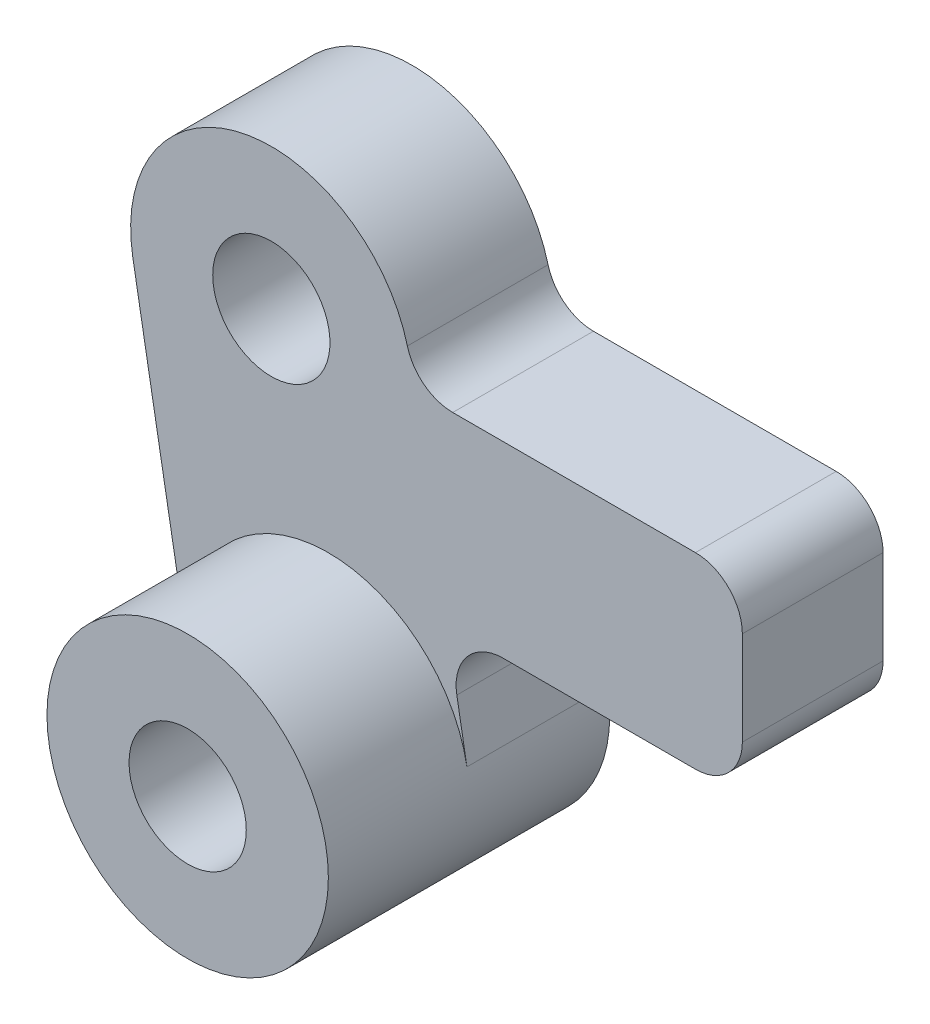
ISO-10303-21;
HEADER;
FILE_DESCRIPTION(('STEP AP214'),'2;1');
FILE_NAME('part.step','',(''),(''),'','','');
FILE_SCHEMA(('AUTOMOTIVE_DESIGN { 1 0 10303 214 1 1 1 1 }'));
ENDSEC;
DATA;
#1=APPLICATION_CONTEXT('core data for automotive mechanical design processes');
#2=APPLICATION_PROTOCOL_DEFINITION('international standard','automotive_design',2000,#1);
#3=PRODUCT_CONTEXT('',#1,'mechanical');
#4=PRODUCT('Part','Part','',(#3));
#5=PRODUCT_RELATED_PRODUCT_CATEGORY('part','',(#4));
#6=PRODUCT_DEFINITION_FORMATION('','',#4);
#7=PRODUCT_DEFINITION_CONTEXT('part definition',#1,'design');
#8=PRODUCT_DEFINITION('design','',#6,#7);
#9=PRODUCT_DEFINITION_SHAPE('','',#8);
#10=(LENGTH_UNIT() NAMED_UNIT(*) SI_UNIT(.MILLI.,.METRE.));
#11=(NAMED_UNIT(*) PLANE_ANGLE_UNIT() SI_UNIT($,.RADIAN.));
#12=(NAMED_UNIT(*) SI_UNIT($,.STERADIAN.) SOLID_ANGLE_UNIT());
#13=UNCERTAINTY_MEASURE_WITH_UNIT(LENGTH_MEASURE(1.E-05),#10,'distance_accuracy_value','');
#14=(GEOMETRIC_REPRESENTATION_CONTEXT(3) GLOBAL_UNCERTAINTY_ASSIGNED_CONTEXT((#13)) GLOBAL_UNIT_ASSIGNED_CONTEXT((#10,
#11,#12)) REPRESENTATION_CONTEXT('',''));
#15=CARTESIAN_POINT('',(0.,0.,0.));
#16=DIRECTION('',(0.,0.,1.));
#17=DIRECTION('',(1.,0.,0.));
#18=AXIS2_PLACEMENT_3D('',#15,#16,#17);
#19=CARTESIAN_POINT('',(0.,0.,7.));
#20=DIRECTION('',(0.,0.,-1.));
#21=DIRECTION('',(-1.,0.,0.));
#22=AXIS2_PLACEMENT_3D('',#19,#20,#21);
#23=PLANE('',#22);
#24=CARTESIAN_POINT('',(15.130794685724,7.42219403539736,7.));
#25=DIRECTION('',(0.,0.,-1.));
#26=DIRECTION('',(-1.,0.,0.));
#27=AXIS2_PLACEMENT_3D('',#24,#25,#26);
#28=CIRCLE('',#27,1.25);
#29=CARTESIAN_POINT('',(13.880794685724,7.42219403539736,7.));
#30=VERTEX_POINT('',#29);
#31=EDGE_CURVE('E168',#30,#30,#28,.T.);
#32=ORIENTED_EDGE('',*,*,#31,.T.);
#33=EDGE_LOOP('',(#32));
#34=FACE_BOUND('',#33,.T.);
#35=DIRECTION('',(-1.,0.,0.));
#36=VECTOR('',#35,1.);
#37=CARTESIAN_POINT('',(0.,3.44313856839816,7.));
#38=LINE('',#37,#36);
#39=CARTESIAN_POINT('',(24.1733814351149,3.44313856839815,7.));
#40=VERTEX_POINT('',#39);
#41=CARTESIAN_POINT('',(20.070442950543,3.44313856839815,7.));
#42=VERTEX_POINT('',#41);
#43=EDGE_CURVE('E219',#40,#42,#38,.T.);
#44=ORIENTED_EDGE('',*,*,#43,.F.);
#45=CARTESIAN_POINT('',(24.1733814351149,4.44313856839815,7.));
#46=DIRECTION('',(0.,0.,-1.));
#47=DIRECTION('',(-1.,0.,0.));
#48=AXIS2_PLACEMENT_3D('',#45,#46,#47);
#49=CIRCLE('',#48,1.);
#50=CARTESIAN_POINT('',(25.1733814351149,4.44313856839815,7.));
#51=VERTEX_POINT('',#50);
#52=EDGE_CURVE('E50',#40,#51,#49,.F.);
#53=ORIENTED_EDGE('',*,*,#52,.T.);
#54=DIRECTION('',(0.,1.,0.));
#55=VECTOR('',#54,1.);
#56=CARTESIAN_POINT('',(25.1733814351149,0.,7.));
#57=LINE('',#56,#55);
#58=CARTESIAN_POINT('',(25.1733814351149,6.44313856839815,7.));
#59=VERTEX_POINT('',#58);
#60=EDGE_CURVE('E218',#51,#59,#57,.T.);
#61=ORIENTED_EDGE('',*,*,#60,.T.);
#62=CARTESIAN_POINT('',(24.1733814351149,6.44313856839815,7.));
#63=DIRECTION('',(0.,0.,-1.));
#64=DIRECTION('',(-1.,0.,0.));
#65=AXIS2_PLACEMENT_3D('',#62,#63,#64);
#66=CIRCLE('',#65,1.);
#67=CARTESIAN_POINT('',(24.1733814351149,7.44313856839815,7.));
#68=VERTEX_POINT('',#67);
#69=EDGE_CURVE('E57',#59,#68,#66,.F.);
#70=ORIENTED_EDGE('',*,*,#69,.T.);
#71=DIRECTION('',(-1.,0.,0.));
#72=VECTOR('',#71,1.);
#73=CARTESIAN_POINT('',(0.,7.44313856839816,7.));
#74=LINE('',#73,#72);
#75=CARTESIAN_POINT('',(18.998309683825,7.44313856839815,7.));
#76=VERTEX_POINT('',#75);
#77=EDGE_CURVE('E228',#68,#76,#74,.T.);
#78=ORIENTED_EDGE('',*,*,#77,.T.);
#79=CARTESIAN_POINT('',(18.998309683825,8.44313856839815,7.));
#80=DIRECTION('',(0.,0.,-1.));
#81=DIRECTION('',(-1.,0.,0.));
#82=AXIS2_PLACEMENT_3D('',#79,#80,#81);
#83=CIRCLE('',#82,1.);
#84=CARTESIAN_POINT('',(18.0314309342997,8.18790243514795,7.));
#85=VERTEX_POINT('',#84);
#86=EDGE_CURVE('E194',#76,#85,#83,.T.);
#87=ORIENTED_EDGE('',*,*,#86,.T.);
#88=CARTESIAN_POINT('',(15.130794685724,7.42219403539736,7.));
#89=DIRECTION('',(0.,0.,-1.));
#90=DIRECTION('',(-1.,0.,0.));
#91=AXIS2_PLACEMENT_3D('',#88,#89,#90);
#92=CIRCLE('',#91,2.99999999999998);
#93=CARTESIAN_POINT('',(12.1763714266874,6.90124950239657,7.));
#94=VERTEX_POINT('',#93);
#95=EDGE_CURVE('E139',#94,#85,#92,.T.);
#96=ORIENTED_EDGE('',*,*,#95,.F.);
#97=DIRECTION('',(0.17364817766693,-0.984807753012208,0.));
#98=VECTOR('',#97,1.);
#99=CARTESIAN_POINT('',(12.9893920741149,2.29038028566714,7.));
#100=LINE('',#99,#98);
#101=CARTESIAN_POINT('',(13.3919086703559,0.0075952313111175,7.));
#102=VERTEX_POINT('',#101);
#103=EDGE_CURVE('E145',#94,#102,#100,.T.);
#104=ORIENTED_EDGE('',*,*,#103,.T.);
#105=CARTESIAN_POINT('',(16.3463319293926,0.528539764311909,7.));
#106=DIRECTION('',(0.,0.,1.));
#107=DIRECTION('',(1.,0.,0.));
#108=AXIS2_PLACEMENT_3D('',#105,#106,#107);
#109=CIRCLE('',#108,3.);
#110=CARTESIAN_POINT('',(19.3007551884292,1.0494842973127,7.));
#111=VERTEX_POINT('',#110);
#112=EDGE_CURVE('E142',#111,#102,#109,.T.);
#113=ORIENTED_EDGE('',*,*,#112,.F.);
#114=DIRECTION('',(0.173648177666929,-0.984807753012208,0.));
#115=VECTOR('',#114,1.);
#116=CARTESIAN_POINT('',(18.8982385921882,3.33226935166871,7.));
#117=LINE('',#116,#115);
#118=CARTESIAN_POINT('',(19.0856351975308,2.26949039073122,7.));
#119=VERTEX_POINT('',#118);
#120=EDGE_CURVE('E127',#119,#111,#117,.T.);
#121=ORIENTED_EDGE('',*,*,#120,.F.);
#122=CARTESIAN_POINT('',(20.070442950543,2.44313856839815,7.));
#123=DIRECTION('',(0.,0.,-1.));
#124=DIRECTION('',(-1.,0.,0.));
#125=AXIS2_PLACEMENT_3D('',#122,#123,#124);
#126=CIRCLE('',#125,1.);
#127=EDGE_CURVE('E188',#119,#42,#126,.T.);
#128=ORIENTED_EDGE('',*,*,#127,.T.);
#129=EDGE_LOOP('',(#44,#53,#61,#70,#78,#87,#96,#104,#113,#121,#128));
#130=FACE_BOUND('',#129,.T.);
#131=ADVANCED_FACE('F41',(#34,#130),#23,.F.);
#132=CARTESIAN_POINT('',(18.8982385921882,3.33226935166871,4.));
#133=DIRECTION('',(-0.984807753012208,-0.173648177666929,0.));
#134=DIRECTION('',(0.173648177666929,-0.984807753012208,0.));
#135=AXIS2_PLACEMENT_3D('',#132,#133,#134);
#136=PLANE('',#135);
#137=DIRECTION('',(0.173648177666929,-0.984807753012208,0.));
#138=VECTOR('',#137,1.);
#139=CARTESIAN_POINT('',(18.8982385921882,3.33226935166871,4.));
#140=LINE('',#139,#138);
#141=CARTESIAN_POINT('',(19.0856351975308,2.26949039073122,4.));
#142=VERTEX_POINT('',#141);
#143=CARTESIAN_POINT('',(19.3007551884292,1.0494842973127,4.));
#144=VERTEX_POINT('',#143);
#145=EDGE_CURVE('E255',#142,#144,#140,.T.);
#146=ORIENTED_EDGE('',*,*,#145,.F.);
#147=DIRECTION('',(0.,0.,-1.));
#148=VECTOR('',#147,1.);
#149=CARTESIAN_POINT('',(19.0856351975308,2.26949039073122,7.));
#150=LINE('',#149,#148);
#151=EDGE_CURVE('E135',#142,#119,#150,.F.);
#152=ORIENTED_EDGE('',*,*,#151,.T.);
#153=ORIENTED_EDGE('',*,*,#120,.T.);
#154=DIRECTION('',(0.,0.,1.));
#155=VECTOR('',#154,1.);
#156=CARTESIAN_POINT('',(19.3007551884292,1.0494842973127,4.));
#157=LINE('',#156,#155);
#158=EDGE_CURVE('E132',#144,#111,#157,.T.);
#159=ORIENTED_EDGE('',*,*,#158,.F.);
#160=EDGE_LOOP('',(#146,#152,#153,#159));
#161=FACE_BOUND('',#160,.T.);
#162=ADVANCED_FACE('F130',(#161),#136,.F.);
#163=CARTESIAN_POINT('',(12.9893920741149,2.29038028566714,4.));
#164=DIRECTION('',(-0.984807753012208,-0.17364817766693,0.));
#165=DIRECTION('',(0.17364817766693,-0.984807753012208,0.));
#166=AXIS2_PLACEMENT_3D('',#163,#164,#165);
#167=PLANE('',#166);
#168=ORIENTED_EDGE('',*,*,#103,.F.);
#169=DIRECTION('',(0.,0.,1.));
#170=VECTOR('',#169,1.);
#171=CARTESIAN_POINT('',(12.1763714266874,6.90124950239657,4.));
#172=LINE('',#171,#170);
#173=CARTESIAN_POINT('',(12.1763714266874,6.90124950239657,4.));
#174=VERTEX_POINT('',#173);
#175=EDGE_CURVE('E157',#174,#94,#172,.T.);
#176=ORIENTED_EDGE('',*,*,#175,.F.);
#177=DIRECTION('',(0.17364817766693,-0.984807753012208,0.));
#178=VECTOR('',#177,1.);
#179=CARTESIAN_POINT('',(12.9893920741149,2.29038028566714,4.));
#180=LINE('',#179,#178);
#181=CARTESIAN_POINT('',(13.3919086703559,0.0075952313111175,4.));
#182=VERTEX_POINT('',#181);
#183=EDGE_CURVE('E138',#174,#182,#180,.T.);
#184=ORIENTED_EDGE('',*,*,#183,.T.);
#185=DIRECTION('',(0.,0.,1.));
#186=VECTOR('',#185,1.);
#187=CARTESIAN_POINT('',(13.3919086703559,0.0075952313111175,4.));
#188=LINE('',#187,#186);
#189=EDGE_CURVE('E158',#182,#102,#188,.T.);
#190=ORIENTED_EDGE('',*,*,#189,.T.);
#191=EDGE_LOOP('',(#168,#176,#184,#190));
#192=FACE_BOUND('',#191,.T.);
#193=ADVANCED_FACE('F304',(#192),#167,.T.);
#194=CARTESIAN_POINT('',(15.130794685724,7.42219403539736,4.));
#195=DIRECTION('',(0.,0.,1.));
#196=DIRECTION('',(1.,0.,0.));
#197=AXIS2_PLACEMENT_3D('',#194,#195,#196);
#198=CYLINDRICAL_SURFACE('',#197,2.99999999999998);
#199=ORIENTED_EDGE('',*,*,#95,.T.);
#200=DIRECTION('',(0.,0.,1.));
#201=VECTOR('',#200,1.);
#202=CARTESIAN_POINT('',(18.0314309342997,8.18790243514795,4.));
#203=LINE('',#202,#201);
#204=CARTESIAN_POINT('',(18.0314309342997,8.18790243514795,4.));
#205=VERTEX_POINT('',#204);
#206=EDGE_CURVE('E177',#85,#205,#203,.F.);
#207=ORIENTED_EDGE('',*,*,#206,.T.);
#208=CARTESIAN_POINT('',(15.130794685724,7.42219403539736,4.));
#209=DIRECTION('',(0.,0.,-1.));
#210=DIRECTION('',(-1.,0.,0.));
#211=AXIS2_PLACEMENT_3D('',#208,#209,#210);
#212=CIRCLE('',#211,2.99999999999998);
#213=EDGE_CURVE('E251',#174,#205,#212,.T.);
#214=ORIENTED_EDGE('',*,*,#213,.F.);
#215=ORIENTED_EDGE('',*,*,#175,.T.);
#216=EDGE_LOOP('',(#199,#207,#214,#215));
#217=FACE_BOUND('',#216,.T.);
#218=ADVANCED_FACE('F267',(#217),#198,.T.);
#219=CARTESIAN_POINT('',(16.3463319293926,0.528539764311909,4.));
#220=DIRECTION('',(0.,0.,1.));
#221=DIRECTION('',(1.,0.,0.));
#222=AXIS2_PLACEMENT_3D('',#219,#220,#221);
#223=CYLINDRICAL_SURFACE('',#222,3.);
#224=ORIENTED_EDGE('',*,*,#158,.T.);
#225=ORIENTED_EDGE('',*,*,#112,.T.);
#226=ORIENTED_EDGE('',*,*,#189,.F.);
#227=CARTESIAN_POINT('',(16.3463319293926,0.528539764311909,4.));
#228=DIRECTION('',(0.,0.,-1.));
#229=DIRECTION('',(-1.,0.,0.));
#230=AXIS2_PLACEMENT_3D('',#227,#228,#229);
#231=CIRCLE('',#230,3.);
#232=EDGE_CURVE('E155',#144,#182,#231,.T.);
#233=ORIENTED_EDGE('',*,*,#232,.F.);
#234=EDGE_LOOP('',(#224,#225,#226,#233));
#235=FACE_BOUND('',#234,.T.);
#236=CARTESIAN_POINT('',(16.3463319293926,0.528539764311909,10.));
#237=DIRECTION('',(0.,0.,1.));
#238=DIRECTION('',(1.,0.,0.));
#239=AXIS2_PLACEMENT_3D('',#236,#237,#238);
#240=CIRCLE('',#239,3.);
#241=CARTESIAN_POINT('',(19.3463319293926,0.528539764311909,10.));
#242=VERTEX_POINT('',#241);
#243=EDGE_CURVE('E150',#242,#242,#240,.T.);
#244=ORIENTED_EDGE('',*,*,#243,.F.);
#245=EDGE_LOOP('',(#244));
#246=FACE_BOUND('',#245,.T.);
#247=ADVANCED_FACE('F153',(#235,#246),#223,.T.);
#248=CARTESIAN_POINT('',(0.,0.,4.));
#249=DIRECTION('',(0.,0.,-1.));
#250=DIRECTION('',(-1.,0.,0.));
#251=AXIS2_PLACEMENT_3D('',#248,#249,#250);
#252=PLANE('',#251);
#253=CARTESIAN_POINT('',(16.3463319293926,0.528539764311909,4.));
#254=DIRECTION('',(0.,0.,-1.));
#255=DIRECTION('',(-1.,0.,0.));
#256=AXIS2_PLACEMENT_3D('',#253,#254,#255);
#257=CIRCLE('',#256,1.25);
#258=CARTESIAN_POINT('',(15.0963319293926,0.528539764311909,4.));
#259=VERTEX_POINT('',#258);
#260=EDGE_CURVE('E227',#259,#259,#257,.T.);
#261=ORIENTED_EDGE('',*,*,#260,.F.);
#262=EDGE_LOOP('',(#261));
#263=FACE_BOUND('',#262,.T.);
#264=CARTESIAN_POINT('',(15.130794685724,7.42219403539736,4.));
#265=DIRECTION('',(0.,0.,-1.));
#266=DIRECTION('',(-1.,0.,0.));
#267=AXIS2_PLACEMENT_3D('',#264,#265,#266);
#268=CIRCLE('',#267,1.25);
#269=CARTESIAN_POINT('',(13.880794685724,7.42219403539736,4.));
#270=VERTEX_POINT('',#269);
#271=EDGE_CURVE('E171',#270,#270,#268,.T.);
#272=ORIENTED_EDGE('',*,*,#271,.F.);
#273=EDGE_LOOP('',(#272));
#274=FACE_BOUND('',#273,.T.);
#275=DIRECTION('',(0.,-1.,0.));
#276=VECTOR('',#275,1.);
#277=CARTESIAN_POINT('',(25.1733814351149,0.,4.));
#278=LINE('',#277,#276);
#279=CARTESIAN_POINT('',(25.1733814351149,6.44313856839815,4.));
#280=VERTEX_POINT('',#279);
#281=CARTESIAN_POINT('',(25.1733814351149,4.44313856839815,4.));
#282=VERTEX_POINT('',#281);
#283=EDGE_CURVE('E235',#280,#282,#278,.T.);
#284=ORIENTED_EDGE('',*,*,#283,.T.);
#285=CARTESIAN_POINT('',(24.1733814351149,4.44313856839815,4.));
#286=DIRECTION('',(0.,0.,-1.));
#287=DIRECTION('',(-1.,0.,0.));
#288=AXIS2_PLACEMENT_3D('',#285,#286,#287);
#289=CIRCLE('',#288,1.);
#290=CARTESIAN_POINT('',(24.1733814351149,3.44313856839815,4.));
#291=VERTEX_POINT('',#290);
#292=EDGE_CURVE('E207',#282,#291,#289,.T.);
#293=ORIENTED_EDGE('',*,*,#292,.T.);
#294=DIRECTION('',(1.,0.,0.));
#295=VECTOR('',#294,1.);
#296=CARTESIAN_POINT('',(0.,3.44313856839816,4.));
#297=LINE('',#296,#295);
#298=CARTESIAN_POINT('',(20.070442950543,3.44313856839815,4.));
#299=VERTEX_POINT('',#298);
#300=EDGE_CURVE('E234',#299,#291,#297,.T.);
#301=ORIENTED_EDGE('',*,*,#300,.F.);
#302=CARTESIAN_POINT('',(20.070442950543,2.44313856839815,4.));
#303=DIRECTION('',(0.,0.,-1.));
#304=DIRECTION('',(-1.,0.,0.));
#305=AXIS2_PLACEMENT_3D('',#302,#303,#304);
#306=CIRCLE('',#305,1.);
#307=EDGE_CURVE('E185',#299,#142,#306,.F.);
#308=ORIENTED_EDGE('',*,*,#307,.T.);
#309=ORIENTED_EDGE('',*,*,#145,.T.);
#310=ORIENTED_EDGE('',*,*,#232,.T.);
#311=ORIENTED_EDGE('',*,*,#183,.F.);
#312=ORIENTED_EDGE('',*,*,#213,.T.);
#313=CARTESIAN_POINT('',(18.998309683825,8.44313856839815,4.));
#314=DIRECTION('',(0.,0.,-1.));
#315=DIRECTION('',(-1.,0.,0.));
#316=AXIS2_PLACEMENT_3D('',#313,#314,#315);
#317=CIRCLE('',#316,1.);
#318=CARTESIAN_POINT('',(18.998309683825,7.44313856839815,4.));
#319=VERTEX_POINT('',#318);
#320=EDGE_CURVE('E191',#205,#319,#317,.F.);
#321=ORIENTED_EDGE('',*,*,#320,.T.);
#322=DIRECTION('',(1.,0.,0.));
#323=VECTOR('',#322,1.);
#324=CARTESIAN_POINT('',(0.,7.44313856839816,4.));
#325=LINE('',#324,#323);
#326=CARTESIAN_POINT('',(24.1733814351149,7.44313856839815,4.));
#327=VERTEX_POINT('',#326);
#328=EDGE_CURVE('E241',#319,#327,#325,.T.);
#329=ORIENTED_EDGE('',*,*,#328,.T.);
#330=CARTESIAN_POINT('',(24.1733814351149,6.44313856839815,4.));
#331=DIRECTION('',(0.,0.,-1.));
#332=DIRECTION('',(-1.,0.,0.));
#333=AXIS2_PLACEMENT_3D('',#330,#331,#332);
#334=CIRCLE('',#333,1.);
#335=EDGE_CURVE('E204',#327,#280,#334,.T.);
#336=ORIENTED_EDGE('',*,*,#335,.T.);
#337=EDGE_LOOP('',(#284,#293,#301,#308,#309,#310,#311,#312,#321,#329,#336));
#338=FACE_BOUND('',#337,.T.);
#339=ADVANCED_FACE('F233',(#263,#274,#338),#252,.T.);
#340=CARTESIAN_POINT('',(15.130794685724,7.42219403539736,10.));
#341=DIRECTION('',(0.,0.,-1.));
#342=DIRECTION('',(-1.,0.,0.));
#343=AXIS2_PLACEMENT_3D('',#340,#341,#342);
#344=CYLINDRICAL_SURFACE('',#343,1.25);
#345=ORIENTED_EDGE('',*,*,#271,.T.);
#346=EDGE_LOOP('',(#345));
#347=FACE_BOUND('',#346,.T.);
#348=ORIENTED_EDGE('',*,*,#31,.F.);
#349=EDGE_LOOP('',(#348));
#350=FACE_BOUND('',#349,.T.);
#351=ADVANCED_FACE('F301',(#347,#350),#344,.F.);
#352=CARTESIAN_POINT('',(16.3463319293926,0.528539764311909,10.));
#353=DIRECTION('',(0.,0.,-1.));
#354=DIRECTION('',(-1.,0.,0.));
#355=AXIS2_PLACEMENT_3D('',#352,#353,#354);
#356=CYLINDRICAL_SURFACE('',#355,1.25);
#357=ORIENTED_EDGE('',*,*,#260,.T.);
#358=EDGE_LOOP('',(#357));
#359=FACE_BOUND('',#358,.T.);
#360=CARTESIAN_POINT('',(16.3463319293926,0.528539764311909,10.));
#361=DIRECTION('',(0.,0.,1.));
#362=DIRECTION('',(1.,0.,0.));
#363=AXIS2_PLACEMENT_3D('',#360,#361,#362);
#364=CIRCLE('',#363,1.25);
#365=CARTESIAN_POINT('',(17.5963319293926,0.528539764311909,10.));
#366=VERTEX_POINT('',#365);
#367=EDGE_CURVE('E151',#366,#366,#364,.T.);
#368=ORIENTED_EDGE('',*,*,#367,.T.);
#369=EDGE_LOOP('',(#368));
#370=FACE_BOUND('',#369,.T.);
#371=ADVANCED_FACE('F287',(#359,#370),#356,.F.);
#372=CARTESIAN_POINT('',(0.,7.44313856839816,15.0622577482985));
#373=DIRECTION('',(0.,1.,0.));
#374=DIRECTION('',(-1.,0.,0.));
#375=AXIS2_PLACEMENT_3D('',#372,#373,#374);
#376=PLANE('',#375);
#377=ORIENTED_EDGE('',*,*,#77,.F.);
#378=DIRECTION('',(0.,0.,-1.));
#379=VECTOR('',#378,1.);
#380=CARTESIAN_POINT('',(24.1733814351149,7.44313856839815,15.0622577482985));
#381=LINE('',#380,#379);
#382=EDGE_CURVE('E11',#68,#327,#381,.T.);
#383=ORIENTED_EDGE('',*,*,#382,.T.);
#384=ORIENTED_EDGE('',*,*,#328,.F.);
#385=DIRECTION('',(0.,0.,1.));
#386=VECTOR('',#385,1.);
#387=CARTESIAN_POINT('',(18.998309683825,7.44313856839815,15.0622577482985));
#388=LINE('',#387,#386);
#389=EDGE_CURVE('E181',#319,#76,#388,.T.);
#390=ORIENTED_EDGE('',*,*,#389,.T.);
#391=EDGE_LOOP('',(#377,#383,#384,#390));
#392=FACE_BOUND('',#391,.T.);
#393=ADVANCED_FACE('F277',(#392),#376,.T.);
#394=CARTESIAN_POINT('',(0.,3.44313856839816,15.0622577482985));
#395=DIRECTION('',(0.,1.,0.));
#396=DIRECTION('',(-1.,0.,0.));
#397=AXIS2_PLACEMENT_3D('',#394,#395,#396);
#398=PLANE('',#397);
#399=ORIENTED_EDGE('',*,*,#300,.T.);
#400=DIRECTION('',(0.,0.,-1.));
#401=VECTOR('',#400,1.);
#402=CARTESIAN_POINT('',(24.1733814351149,3.44313856839815,7.));
#403=LINE('',#402,#401);
#404=EDGE_CURVE('E65',#291,#40,#403,.F.);
#405=ORIENTED_EDGE('',*,*,#404,.T.);
#406=ORIENTED_EDGE('',*,*,#43,.T.);
#407=DIRECTION('',(0.,0.,-1.));
#408=VECTOR('',#407,1.);
#409=CARTESIAN_POINT('',(20.070442950543,3.44313856839815,4.));
#410=LINE('',#409,#408);
#411=EDGE_CURVE('E163',#42,#299,#410,.T.);
#412=ORIENTED_EDGE('',*,*,#411,.T.);
#413=EDGE_LOOP('',(#399,#405,#406,#412));
#414=FACE_BOUND('',#413,.T.);
#415=ADVANCED_FACE('F236',(#414),#398,.F.);
#416=CARTESIAN_POINT('',(25.1733814351149,0.,15.0622577482985));
#417=DIRECTION('',(1.,0.,0.));
#418=DIRECTION('',(0.,0.,-1.));
#419=AXIS2_PLACEMENT_3D('',#416,#417,#418);
#420=PLANE('',#419);
#421=ORIENTED_EDGE('',*,*,#60,.F.);
#422=DIRECTION('',(0.,0.,-1.));
#423=VECTOR('',#422,1.);
#424=CARTESIAN_POINT('',(25.1733814351149,4.44313856839815,4.));
#425=LINE('',#424,#423);
#426=EDGE_CURVE('E200',#51,#282,#425,.T.);
#427=ORIENTED_EDGE('',*,*,#426,.T.);
#428=ORIENTED_EDGE('',*,*,#283,.F.);
#429=DIRECTION('',(0.,0.,-1.));
#430=VECTOR('',#429,1.);
#431=CARTESIAN_POINT('',(25.1733814351149,6.44313856839815,15.0622577482985));
#432=LINE('',#431,#430);
#433=EDGE_CURVE('E197',#280,#59,#432,.F.);
#434=ORIENTED_EDGE('',*,*,#433,.T.);
#435=EDGE_LOOP('',(#421,#427,#428,#434));
#436=FACE_BOUND('',#435,.T.);
#437=ADVANCED_FACE('F223',(#436),#420,.T.);
#438=CARTESIAN_POINT('',(0.,0.,10.));
#439=DIRECTION('',(0.,0.,1.));
#440=DIRECTION('',(1.,0.,0.));
#441=AXIS2_PLACEMENT_3D('',#438,#439,#440);
#442=PLANE('',#441);
#443=ORIENTED_EDGE('',*,*,#367,.F.);
#444=EDGE_LOOP('',(#443));
#445=FACE_BOUND('',#444,.T.);
#446=ORIENTED_EDGE('',*,*,#243,.T.);
#447=EDGE_LOOP('',(#446));
#448=FACE_BOUND('',#447,.T.);
#449=ADVANCED_FACE('F289',(#445,#448),#442,.T.);
#450=CARTESIAN_POINT('',(20.070442950543,2.44313856839815,15.0622577482985));
#451=DIRECTION('',(0.,0.,1.));
#452=DIRECTION('',(1.,0.,0.));
#453=AXIS2_PLACEMENT_3D('',#450,#451,#452);
#454=CYLINDRICAL_SURFACE('',#453,1.);
#455=ORIENTED_EDGE('',*,*,#127,.F.);
#456=ORIENTED_EDGE('',*,*,#151,.F.);
#457=ORIENTED_EDGE('',*,*,#307,.F.);
#458=ORIENTED_EDGE('',*,*,#411,.F.);
#459=EDGE_LOOP('',(#455,#456,#457,#458));
#460=FACE_BOUND('',#459,.T.);
#461=ADVANCED_FACE('F292',(#460),#454,.F.);
#462=CARTESIAN_POINT('',(18.998309683825,8.44313856839815,4.));
#463=DIRECTION('',(0.,0.,1.));
#464=DIRECTION('',(1.,0.,0.));
#465=AXIS2_PLACEMENT_3D('',#462,#463,#464);
#466=CYLINDRICAL_SURFACE('',#465,1.);
#467=ORIENTED_EDGE('',*,*,#86,.F.);
#468=ORIENTED_EDGE('',*,*,#389,.F.);
#469=ORIENTED_EDGE('',*,*,#320,.F.);
#470=ORIENTED_EDGE('',*,*,#206,.F.);
#471=EDGE_LOOP('',(#467,#468,#469,#470));
#472=FACE_BOUND('',#471,.T.);
#473=ADVANCED_FACE('F271',(#472),#466,.F.);
#474=CARTESIAN_POINT('',(24.1733814351149,4.44313856839815,15.0622577482985));
#475=DIRECTION('',(0.,0.,1.));
#476=DIRECTION('',(1.,0.,0.));
#477=AXIS2_PLACEMENT_3D('',#474,#475,#476);
#478=CYLINDRICAL_SURFACE('',#477,1.);
#479=ORIENTED_EDGE('',*,*,#52,.F.);
#480=ORIENTED_EDGE('',*,*,#404,.F.);
#481=ORIENTED_EDGE('',*,*,#292,.F.);
#482=ORIENTED_EDGE('',*,*,#426,.F.);
#483=EDGE_LOOP('',(#479,#480,#481,#482));
#484=FACE_BOUND('',#483,.T.);
#485=ADVANCED_FACE('F230',(#484),#478,.T.);
#486=CARTESIAN_POINT('',(24.1733814351149,6.44313856839815,15.0622577482985));
#487=DIRECTION('',(0.,0.,-1.));
#488=DIRECTION('',(-1.,0.,0.));
#489=AXIS2_PLACEMENT_3D('',#486,#487,#488);
#490=CYLINDRICAL_SURFACE('',#489,1.);
#491=ORIENTED_EDGE('',*,*,#69,.F.);
#492=ORIENTED_EDGE('',*,*,#433,.F.);
#493=ORIENTED_EDGE('',*,*,#335,.F.);
#494=ORIENTED_EDGE('',*,*,#382,.F.);
#495=EDGE_LOOP('',(#491,#492,#493,#494));
#496=FACE_BOUND('',#495,.T.);
#497=ADVANCED_FACE('F43',(#496),#490,.T.);
#498=CLOSED_SHELL('',(#131,#162,#193,#218,#247,#339,#351,#371,#393,#415,#437,#449,#461,#473,
#485,#497));
#499=MANIFOLD_SOLID_BREP('B2',#498);
#500=ADVANCED_BREP_SHAPE_REPRESENTATION('',(#18,#499),#14);
#501=SHAPE_DEFINITION_REPRESENTATION(#9,#500);
ENDSEC;
END-ISO-10303-21;
